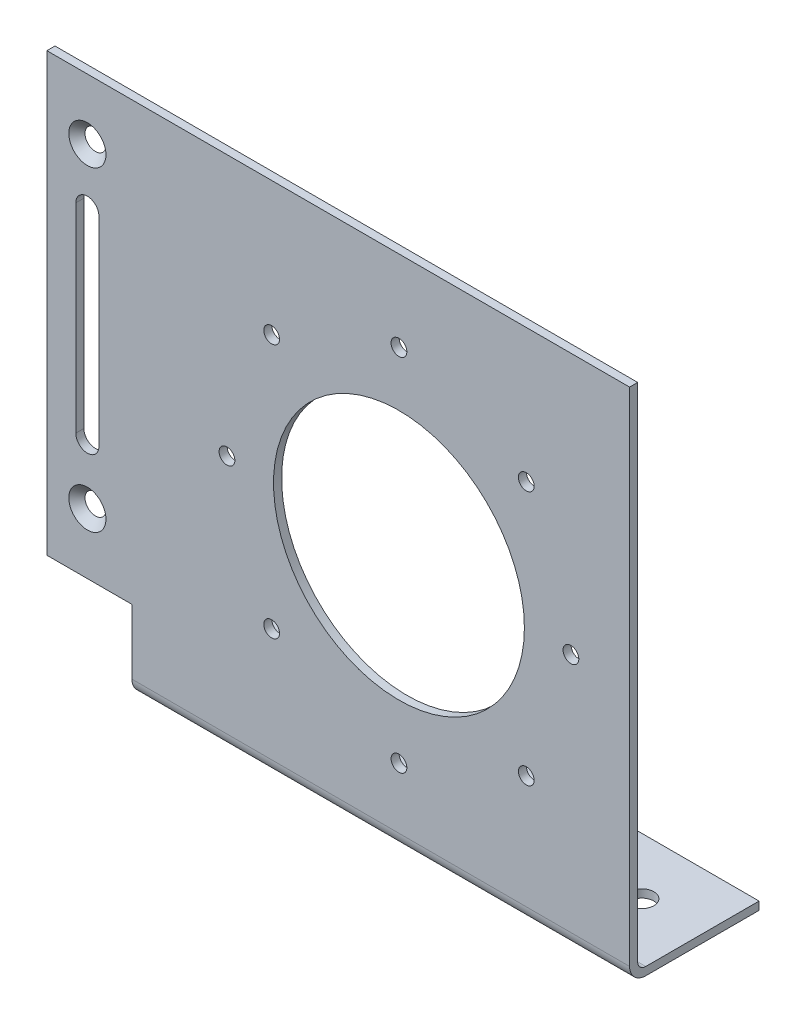
ISO-10303-21;
HEADER;
FILE_DESCRIPTION(('STEP AP214'),'2;1');
FILE_NAME('part.step','',(''),(''),'','','');
FILE_SCHEMA(('AUTOMOTIVE_DESIGN { 1 0 10303 214 1 1 1 1 }'));
ENDSEC;
DATA;
#1=APPLICATION_CONTEXT('core data for automotive mechanical design processes');
#2=APPLICATION_PROTOCOL_DEFINITION('international standard','automotive_design',2000,#1);
#3=PRODUCT_CONTEXT('',#1,'mechanical');
#4=PRODUCT('Part','Part','',(#3));
#5=PRODUCT_RELATED_PRODUCT_CATEGORY('part','',(#4));
#6=PRODUCT_DEFINITION_FORMATION('','',#4);
#7=PRODUCT_DEFINITION_CONTEXT('part definition',#1,'design');
#8=PRODUCT_DEFINITION('design','',#6,#7);
#9=PRODUCT_DEFINITION_SHAPE('','',#8);
#10=(LENGTH_UNIT() NAMED_UNIT(*) SI_UNIT(.MILLI.,.METRE.));
#11=(NAMED_UNIT(*) PLANE_ANGLE_UNIT() SI_UNIT($,.RADIAN.));
#12=(NAMED_UNIT(*) SI_UNIT($,.STERADIAN.) SOLID_ANGLE_UNIT());
#13=UNCERTAINTY_MEASURE_WITH_UNIT(LENGTH_MEASURE(1.E-05),#10,'distance_accuracy_value','');
#14=(GEOMETRIC_REPRESENTATION_CONTEXT(3) GLOBAL_UNCERTAINTY_ASSIGNED_CONTEXT((#13)) GLOBAL_UNIT_ASSIGNED_CONTEXT((#10,
#11,#12)) REPRESENTATION_CONTEXT('',''));
#15=CARTESIAN_POINT('',(0.,0.,0.));
#16=DIRECTION('',(0.,0.,1.));
#17=DIRECTION('',(1.,0.,0.));
#18=AXIS2_PLACEMENT_3D('',#15,#16,#17);
#19=CARTESIAN_POINT('',(0.,0.,0.));
#20=DIRECTION('',(0.,0.,1.));
#21=DIRECTION('',(1.,0.,0.));
#22=AXIS2_PLACEMENT_3D('',#19,#20,#21);
#23=PLANE('',#22);
#24=CARTESIAN_POINT('',(17.9765527034874,41.3541753746779,0.));
#25=DIRECTION('',(0.,0.,1.));
#26=DIRECTION('',(1.,0.,0.));
#27=AXIS2_PLACEMENT_3D('',#24,#25,#26);
#28=CIRCLE('',#27,1.95);
#29=CARTESIAN_POINT('',(19.9265527034874,41.3541753746779,0.));
#30=VERTEX_POINT('',#29);
#31=EDGE_CURVE('E205',#30,#30,#28,.T.);
#32=ORIENTED_EDGE('',*,*,#31,.T.);
#33=EDGE_LOOP('',(#32));
#34=FACE_BOUND('',#33,.T.);
#35=CARTESIAN_POINT('',(-13.489699059314,28.3204271374793,0.));
#36=DIRECTION('',(0.,0.,1.));
#37=DIRECTION('',(1.,0.,0.));
#38=AXIS2_PLACEMENT_3D('',#35,#36,#37);
#39=CIRCLE('',#38,1.95);
#40=CARTESIAN_POINT('',(-11.539699059314,28.3204271374793,0.));
#41=VERTEX_POINT('',#40);
#42=EDGE_CURVE('E202',#41,#41,#39,.T.);
#43=ORIENTED_EDGE('',*,*,#42,.T.);
#44=EDGE_LOOP('',(#43));
#45=FACE_BOUND('',#44,.T.);
#46=CARTESIAN_POINT('',(60.4765527034874,-3.14582462532208,0.));
#47=DIRECTION('',(0.,0.,1.));
#48=DIRECTION('',(1.,0.,0.));
#49=AXIS2_PLACEMENT_3D('',#46,#47,#48);
#50=CIRCLE('',#49,1.95);
#51=CARTESIAN_POINT('',(62.4265527034874,-3.14582462532208,0.));
#52=VERTEX_POINT('',#51);
#53=EDGE_CURVE('E199',#52,#52,#50,.T.);
#54=ORIENTED_EDGE('',*,*,#53,.T.);
#55=EDGE_LOOP('',(#54));
#56=FACE_BOUND('',#55,.T.);
#57=CARTESIAN_POINT('',(-13.489699059314,-34.6120763881235,0.));
#58=DIRECTION('',(0.,0.,1.));
#59=DIRECTION('',(1.,0.,0.));
#60=AXIS2_PLACEMENT_3D('',#57,#58,#59);
#61=CIRCLE('',#60,1.95);
#62=CARTESIAN_POINT('',(-11.539699059314,-34.6120763881235,0.));
#63=VERTEX_POINT('',#62);
#64=EDGE_CURVE('E196',#63,#63,#61,.T.);
#65=ORIENTED_EDGE('',*,*,#64,.T.);
#66=EDGE_LOOP('',(#65));
#67=FACE_BOUND('',#66,.T.);
#68=CARTESIAN_POINT('',(17.9765527034874,-47.6458246253221,0.));
#69=DIRECTION('',(0.,0.,1.));
#70=DIRECTION('',(1.,0.,0.));
#71=AXIS2_PLACEMENT_3D('',#68,#69,#70);
#72=CIRCLE('',#71,1.95);
#73=CARTESIAN_POINT('',(19.9265527034874,-47.6458246253221,0.));
#74=VERTEX_POINT('',#73);
#75=EDGE_CURVE('E193',#74,#74,#72,.T.);
#76=ORIENTED_EDGE('',*,*,#75,.T.);
#77=EDGE_LOOP('',(#76));
#78=FACE_BOUND('',#77,.T.);
#79=CARTESIAN_POINT('',(49.4428044662887,28.3204271374793,0.));
#80=DIRECTION('',(0.,0.,1.));
#81=DIRECTION('',(1.,0.,0.));
#82=AXIS2_PLACEMENT_3D('',#79,#80,#81);
#83=CIRCLE('',#82,1.95);
#84=CARTESIAN_POINT('',(51.3928044662887,28.3204271374793,0.));
#85=VERTEX_POINT('',#84);
#86=EDGE_CURVE('E190',#85,#85,#83,.T.);
#87=ORIENTED_EDGE('',*,*,#86,.T.);
#88=EDGE_LOOP('',(#87));
#89=FACE_BOUND('',#88,.T.);
#90=CARTESIAN_POINT('',(17.9765527034874,-3.14582462532208,0.));
#91=DIRECTION('',(0.,0.,1.));
#92=DIRECTION('',(1.,0.,0.));
#93=AXIS2_PLACEMENT_3D('',#90,#91,#92);
#94=CIRCLE('',#93,31.);
#95=CARTESIAN_POINT('',(48.9765527034874,-3.14582462532208,0.));
#96=VERTEX_POINT('',#95);
#97=EDGE_CURVE('E187',#96,#96,#94,.T.);
#98=ORIENTED_EDGE('',*,*,#97,.T.);
#99=EDGE_LOOP('',(#98));
#100=FACE_BOUND('',#99,.T.);
#101=CARTESIAN_POINT('',(-24.5234472965126,-3.14582462532208,0.));
#102=DIRECTION('',(0.,0.,1.));
#103=DIRECTION('',(1.,0.,0.));
#104=AXIS2_PLACEMENT_3D('',#101,#102,#103);
#105=CIRCLE('',#104,1.95);
#106=CARTESIAN_POINT('',(-22.5734472965126,-3.14582462532208,0.));
#107=VERTEX_POINT('',#106);
#108=EDGE_CURVE('E184',#107,#107,#105,.T.);
#109=ORIENTED_EDGE('',*,*,#108,.T.);
#110=EDGE_LOOP('',(#109));
#111=FACE_BOUND('',#110,.T.);
#112=CARTESIAN_POINT('',(49.4428044662887,-34.6120763881234,0.));
#113=DIRECTION('',(0.,0.,1.));
#114=DIRECTION('',(1.,0.,0.));
#115=AXIS2_PLACEMENT_3D('',#112,#113,#114);
#116=CIRCLE('',#115,1.95);
#117=CARTESIAN_POINT('',(51.3928044662887,-34.6120763881234,0.));
#118=VERTEX_POINT('',#117);
#119=EDGE_CURVE('E181',#118,#118,#116,.T.);
#120=ORIENTED_EDGE('',*,*,#119,.T.);
#121=EDGE_LOOP('',(#120));
#122=FACE_BOUND('',#121,.T.);
#123=DIRECTION('',(0.,-1.,0.));
#124=VECTOR('',#123,1.);
#125=CARTESIAN_POINT('',(-61.8816570408644,0.,0.));
#126=LINE('',#125,#124);
#127=CARTESIAN_POINT('',(-61.8816570408644,32.3541753746779,0.));
#128=VERTEX_POINT('',#127);
#129=CARTESIAN_POINT('',(-61.8816570408644,-16.9351822342256,0.));
#130=VERTEX_POINT('',#129);
#131=EDGE_CURVE('E178',#128,#130,#126,.T.);
#132=ORIENTED_EDGE('',*,*,#131,.T.);
#133=CARTESIAN_POINT('',(-59.0234472965126,-16.9351822342256,0.));
#134=DIRECTION('',(0.,0.,1.));
#135=DIRECTION('',(1.,0.,0.));
#136=AXIS2_PLACEMENT_3D('',#133,#134,#135);
#137=CIRCLE('',#136,2.85820974435177);
#138=CARTESIAN_POINT('',(-56.1652375521608,-16.9351822342256,0.));
#139=VERTEX_POINT('',#138);
#140=EDGE_CURVE('E144',#130,#139,#137,.T.);
#141=ORIENTED_EDGE('',*,*,#140,.T.);
#142=DIRECTION('',(0.,1.,0.));
#143=VECTOR('',#142,1.);
#144=CARTESIAN_POINT('',(-56.1652375521608,0.,0.));
#145=LINE('',#144,#143);
#146=CARTESIAN_POINT('',(-56.1652375521608,32.3541753746779,0.));
#147=VERTEX_POINT('',#146);
#148=EDGE_CURVE('E171',#139,#147,#145,.T.);
#149=ORIENTED_EDGE('',*,*,#148,.T.);
#150=CARTESIAN_POINT('',(-59.0234472965126,32.3541753746779,0.));
#151=DIRECTION('',(0.,0.,1.));
#152=DIRECTION('',(1.,0.,0.));
#153=AXIS2_PLACEMENT_3D('',#150,#151,#152);
#154=CIRCLE('',#153,2.85820974435178);
#155=EDGE_CURVE('E174',#147,#128,#154,.T.);
#156=ORIENTED_EDGE('',*,*,#155,.T.);
#157=EDGE_LOOP('',(#132,#141,#149,#156));
#158=FACE_BOUND('',#157,.T.);
#159=CARTESIAN_POINT('',(-59.0234472965126,46.3541753746779,0.));
#160=DIRECTION('',(0.,0.,1.));
#161=DIRECTION('',(1.,0.,0.));
#162=AXIS2_PLACEMENT_3D('',#159,#160,#161);
#163=CIRCLE('',#162,2.59);
#164=CARTESIAN_POINT('',(-56.4334472965126,46.3541753746779,0.));
#165=VERTEX_POINT('',#164);
#166=EDGE_CURVE('E211',#165,#165,#163,.T.);
#167=ORIENTED_EDGE('',*,*,#166,.T.);
#168=EDGE_LOOP('',(#167));
#169=FACE_BOUND('',#168,.T.);
#170=CARTESIAN_POINT('',(-59.0234472965126,-31.6458246253221,0.));
#171=DIRECTION('',(0.,0.,1.));
#172=DIRECTION('',(1.,0.,0.));
#173=AXIS2_PLACEMENT_3D('',#170,#171,#172);
#174=CIRCLE('',#173,2.59);
#175=CARTESIAN_POINT('',(-56.4334472965126,-31.6458246253221,0.));
#176=VERTEX_POINT('',#175);
#177=EDGE_CURVE('E43',#176,#176,#174,.T.);
#178=ORIENTED_EDGE('',*,*,#177,.T.);
#179=EDGE_LOOP('',(#178));
#180=FACE_BOUND('',#179,.T.);
#181=DIRECTION('',(0.,1.,0.));
#182=VECTOR('',#181,1.);
#183=CARTESIAN_POINT('',(74.9765527034874,-66.6458246253221,0.));
#184=LINE('',#183,#182);
#185=CARTESIAN_POINT('',(74.9765527034874,-62.6458246253221,0.));
#186=VERTEX_POINT('',#185);
#187=CARTESIAN_POINT('',(74.9765527034874,61.3541753746779,0.));
#188=VERTEX_POINT('',#187);
#189=EDGE_CURVE('E263',#186,#188,#184,.T.);
#190=ORIENTED_EDGE('',*,*,#189,.F.);
#191=DIRECTION('',(1.,0.,0.));
#192=VECTOR('',#191,1.);
#193=CARTESIAN_POINT('',(-48.0234472965126,-62.6458246253221,0.));
#194=LINE('',#193,#192);
#195=CARTESIAN_POINT('',(-48.0234472965126,-62.6458246253221,0.));
#196=VERTEX_POINT('',#195);
#197=EDGE_CURVE('E284',#186,#196,#194,.F.);
#198=ORIENTED_EDGE('',*,*,#197,.T.);
#199=DIRECTION('',(0.,-1.,0.));
#200=VECTOR('',#199,1.);
#201=CARTESIAN_POINT('',(-48.0234472965126,-46.6458246253221,0.));
#202=LINE('',#201,#200);
#203=CARTESIAN_POINT('',(-48.0234472965126,-46.6458246253221,0.));
#204=VERTEX_POINT('',#203);
#205=EDGE_CURVE('E260',#204,#196,#202,.T.);
#206=ORIENTED_EDGE('',*,*,#205,.F.);
#207=DIRECTION('',(1.,0.,0.));
#208=VECTOR('',#207,1.);
#209=CARTESIAN_POINT('',(-69.0234472965126,-46.6458246253221,0.));
#210=LINE('',#209,#208);
#211=CARTESIAN_POINT('',(-69.0234472965126,-46.6458246253221,0.));
#212=VERTEX_POINT('',#211);
#213=EDGE_CURVE('E258',#212,#204,#210,.T.);
#214=ORIENTED_EDGE('',*,*,#213,.F.);
#215=DIRECTION('',(0.,-1.,0.));
#216=VECTOR('',#215,1.);
#217=CARTESIAN_POINT('',(-69.0234472965126,-46.6458246253221,0.));
#218=LINE('',#217,#216);
#219=CARTESIAN_POINT('',(-69.0234472965126,61.3541753746779,0.));
#220=VERTEX_POINT('',#219);
#221=EDGE_CURVE('E241',#220,#212,#218,.T.);
#222=ORIENTED_EDGE('',*,*,#221,.F.);
#223=DIRECTION('',(-1.,0.,0.));
#224=VECTOR('',#223,1.);
#225=CARTESIAN_POINT('',(74.9765527034874,61.3541753746779,0.));
#226=LINE('',#225,#224);
#227=EDGE_CURVE('E246',#188,#220,#226,.T.);
#228=ORIENTED_EDGE('',*,*,#227,.F.);
#229=EDGE_LOOP('',(#190,#198,#206,#214,#222,#228));
#230=FACE_BOUND('',#229,.T.);
#231=ADVANCED_FACE('F39',(#34,#45,#56,#67,#78,#89,#100,#111,#122,#158,#169,#180,#230),#23,.F.);
#232=CARTESIAN_POINT('',(-69.0234472965126,-46.6458246253221,2.));
#233=DIRECTION('',(1.,0.,0.));
#234=DIRECTION('',(0.,0.,-1.));
#235=AXIS2_PLACEMENT_3D('',#232,#233,#234);
#236=PLANE('',#235);
#237=ORIENTED_EDGE('',*,*,#221,.T.);
#238=DIRECTION('',(0.,0.,-1.));
#239=VECTOR('',#238,1.);
#240=CARTESIAN_POINT('',(-69.0234472965126,-46.6458246253221,2.));
#241=LINE('',#240,#239);
#242=CARTESIAN_POINT('',(-69.0234472965126,-46.6458246253221,2.));
#243=VERTEX_POINT('',#242);
#244=EDGE_CURVE('E278',#243,#212,#241,.T.);
#245=ORIENTED_EDGE('',*,*,#244,.F.);
#246=DIRECTION('',(0.,-1.,0.));
#247=VECTOR('',#246,1.);
#248=CARTESIAN_POINT('',(-69.0234472965126,-46.6458246253221,2.));
#249=LINE('',#248,#247);
#250=CARTESIAN_POINT('',(-69.0234472965126,61.3541753746779,2.));
#251=VERTEX_POINT('',#250);
#252=EDGE_CURVE('E242',#251,#243,#249,.T.);
#253=ORIENTED_EDGE('',*,*,#252,.F.);
#254=DIRECTION('',(0.,0.,-1.));
#255=VECTOR('',#254,1.);
#256=CARTESIAN_POINT('',(-69.0234472965126,61.3541753746779,2.));
#257=LINE('',#256,#255);
#258=EDGE_CURVE('E255',#251,#220,#257,.T.);
#259=ORIENTED_EDGE('',*,*,#258,.T.);
#260=EDGE_LOOP('',(#237,#245,#253,#259));
#261=FACE_BOUND('',#260,.T.);
#262=ADVANCED_FACE('F319',(#261),#236,.F.);
#263=CARTESIAN_POINT('',(-69.0234472965126,-46.6458246253221,2.));
#264=DIRECTION('',(0.,1.,0.));
#265=DIRECTION('',(0.,0.,1.));
#266=AXIS2_PLACEMENT_3D('',#263,#264,#265);
#267=PLANE('',#266);
#268=ORIENTED_EDGE('',*,*,#213,.T.);
#269=DIRECTION('',(0.,0.,-1.));
#270=VECTOR('',#269,1.);
#271=CARTESIAN_POINT('',(-48.0234472965126,-46.6458246253221,2.));
#272=LINE('',#271,#270);
#273=CARTESIAN_POINT('',(-48.0234472965126,-46.6458246253221,2.));
#274=VERTEX_POINT('',#273);
#275=EDGE_CURVE('E275',#274,#204,#272,.T.);
#276=ORIENTED_EDGE('',*,*,#275,.F.);
#277=DIRECTION('',(1.,0.,0.));
#278=VECTOR('',#277,1.);
#279=CARTESIAN_POINT('',(-69.0234472965126,-46.6458246253221,2.));
#280=LINE('',#279,#278);
#281=EDGE_CURVE('E245',#243,#274,#280,.T.);
#282=ORIENTED_EDGE('',*,*,#281,.F.);
#283=ORIENTED_EDGE('',*,*,#244,.T.);
#284=EDGE_LOOP('',(#268,#276,#282,#283));
#285=FACE_BOUND('',#284,.T.);
#286=ADVANCED_FACE('F327',(#285),#267,.F.);
#287=CARTESIAN_POINT('',(-48.0234472965126,-46.6458246253221,2.));
#288=DIRECTION('',(1.,0.,0.));
#289=DIRECTION('',(0.,1.,0.));
#290=AXIS2_PLACEMENT_3D('',#287,#288,#289);
#291=PLANE('',#290);
#292=DIRECTION('',(0.,0.,-1.));
#293=VECTOR('',#292,1.);
#294=CARTESIAN_POINT('',(-48.0234472965126,-66.6458246253221,2.));
#295=LINE('',#294,#293);
#296=CARTESIAN_POINT('',(-48.0234472965126,-66.6458246253221,-2.));
#297=VERTEX_POINT('',#296);
#298=CARTESIAN_POINT('',(-48.0234472965126,-66.6458246253221,-30.));
#299=VERTEX_POINT('',#298);
#300=EDGE_CURVE('E273',#297,#299,#295,.T.);
#301=ORIENTED_EDGE('',*,*,#300,.F.);
#302=CARTESIAN_POINT('',(-48.0234472965126,-62.6458246253221,-2.));
#303=DIRECTION('',(1.,0.,0.));
#304=DIRECTION('',(0.,1.,0.));
#305=AXIS2_PLACEMENT_3D('',#302,#303,#304);
#306=CIRCLE('',#305,4.);
#307=CARTESIAN_POINT('',(-48.0234472965126,-62.6458246253221,2.));
#308=VERTEX_POINT('',#307);
#309=EDGE_CURVE('E11',#297,#308,#306,.F.);
#310=ORIENTED_EDGE('',*,*,#309,.T.);
#311=DIRECTION('',(0.,-1.,0.));
#312=VECTOR('',#311,1.);
#313=CARTESIAN_POINT('',(-48.0234472965126,-46.6458246253221,2.));
#314=LINE('',#313,#312);
#315=EDGE_CURVE('E248',#274,#308,#314,.T.);
#316=ORIENTED_EDGE('',*,*,#315,.F.);
#317=ORIENTED_EDGE('',*,*,#275,.T.);
#318=ORIENTED_EDGE('',*,*,#205,.T.);
#319=CARTESIAN_POINT('',(-48.0234472965126,-62.6458246253221,-2.));
#320=DIRECTION('',(1.,0.,0.));
#321=DIRECTION('',(0.,1.,0.));
#322=AXIS2_PLACEMENT_3D('',#319,#320,#321);
#323=CIRCLE('',#322,2.);
#324=CARTESIAN_POINT('',(-48.0234472965126,-64.6458246253221,-2.));
#325=VERTEX_POINT('',#324);
#326=EDGE_CURVE('E288',#196,#325,#323,.T.);
#327=ORIENTED_EDGE('',*,*,#326,.T.);
#328=DIRECTION('',(0.,0.,1.));
#329=VECTOR('',#328,1.);
#330=CARTESIAN_POINT('',(-48.0234472965126,-64.6458246253221,-30.));
#331=LINE('',#330,#329);
#332=CARTESIAN_POINT('',(-48.0234472965126,-64.6458246253221,-30.));
#333=VERTEX_POINT('',#332);
#334=EDGE_CURVE('E238',#333,#325,#331,.T.);
#335=ORIENTED_EDGE('',*,*,#334,.F.);
#336=DIRECTION('',(0.,1.,0.));
#337=VECTOR('',#336,1.);
#338=CARTESIAN_POINT('',(-48.0234472965126,-64.6458246253221,-30.));
#339=LINE('',#338,#337);
#340=EDGE_CURVE('E231',#299,#333,#339,.T.);
#341=ORIENTED_EDGE('',*,*,#340,.F.);
#342=EDGE_LOOP('',(#301,#310,#316,#317,#318,#327,#335,#341));
#343=FACE_BOUND('',#342,.T.);
#344=ADVANCED_FACE('F345',(#343),#291,.F.);
#345=CARTESIAN_POINT('',(74.9765527034874,-66.6458246253221,2.));
#346=DIRECTION('',(0.,1.,0.));
#347=DIRECTION('',(-1.,0.,0.));
#348=AXIS2_PLACEMENT_3D('',#345,#346,#347);
#349=PLANE('',#348);
#350=CARTESIAN_POINT('',(-33.0234472965126,-66.6458246253221,-16.));
#351=DIRECTION('',(0.,-1.,0.));
#352=DIRECTION('',(1.,0.,0.));
#353=AXIS2_PLACEMENT_3D('',#350,#351,#352);
#354=CIRCLE('',#353,3.);
#355=CARTESIAN_POINT('',(-30.0234472965126,-66.6458246253221,-16.));
#356=VERTEX_POINT('',#355);
#357=EDGE_CURVE('E217',#356,#356,#354,.T.);
#358=ORIENTED_EDGE('',*,*,#357,.F.);
#359=EDGE_LOOP('',(#358));
#360=FACE_BOUND('',#359,.T.);
#361=CARTESIAN_POINT('',(59.9765527034874,-66.6458246253221,-16.));
#362=DIRECTION('',(0.,-1.,0.));
#363=DIRECTION('',(1.,0.,0.));
#364=AXIS2_PLACEMENT_3D('',#361,#362,#363);
#365=CIRCLE('',#364,3.00000000000001);
#366=CARTESIAN_POINT('',(62.9765527034874,-66.6458246253221,-16.));
#367=VERTEX_POINT('',#366);
#368=EDGE_CURVE('E221',#367,#367,#365,.T.);
#369=ORIENTED_EDGE('',*,*,#368,.F.);
#370=EDGE_LOOP('',(#369));
#371=FACE_BOUND('',#370,.T.);
#372=DIRECTION('',(0.,0.,-1.));
#373=VECTOR('',#372,1.);
#374=CARTESIAN_POINT('',(74.9765527034874,-66.6458246253221,2.));
#375=LINE('',#374,#373);
#376=CARTESIAN_POINT('',(74.9765527034874,-66.6458246253221,-2.));
#377=VERTEX_POINT('',#376);
#378=CARTESIAN_POINT('',(74.9765527034874,-66.6458246253221,-30.));
#379=VERTEX_POINT('',#378);
#380=EDGE_CURVE('E271',#377,#379,#375,.T.);
#381=ORIENTED_EDGE('',*,*,#380,.F.);
#382=DIRECTION('',(1.,0.,0.));
#383=VECTOR('',#382,1.);
#384=CARTESIAN_POINT('',(-48.0234472965126,-66.6458246253221,-2.));
#385=LINE('',#384,#383);
#386=EDGE_CURVE('E48',#377,#297,#385,.F.);
#387=ORIENTED_EDGE('',*,*,#386,.T.);
#388=ORIENTED_EDGE('',*,*,#300,.T.);
#389=DIRECTION('',(-1.,0.,0.));
#390=VECTOR('',#389,1.);
#391=CARTESIAN_POINT('',(74.9765527034874,-66.6458246253221,-30.));
#392=LINE('',#391,#390);
#393=EDGE_CURVE('E227',#379,#299,#392,.T.);
#394=ORIENTED_EDGE('',*,*,#393,.F.);
#395=EDGE_LOOP('',(#381,#387,#388,#394));
#396=FACE_BOUND('',#395,.T.);
#397=ADVANCED_FACE('F341',(#360,#371,#396),#349,.F.);
#398=CARTESIAN_POINT('',(74.9765527034874,-66.6458246253221,2.));
#399=DIRECTION('',(-1.,0.,0.));
#400=DIRECTION('',(0.,0.,1.));
#401=AXIS2_PLACEMENT_3D('',#398,#399,#400);
#402=PLANE('',#401);
#403=DIRECTION('',(0.,1.,0.));
#404=VECTOR('',#403,1.);
#405=CARTESIAN_POINT('',(74.9765527034874,-66.6458246253221,2.));
#406=LINE('',#405,#404);
#407=CARTESIAN_POINT('',(74.9765527034874,-62.6458246253221,2.));
#408=VERTEX_POINT('',#407);
#409=CARTESIAN_POINT('',(74.9765527034874,61.3541753746779,2.));
#410=VERTEX_POINT('',#409);
#411=EDGE_CURVE('E251',#408,#410,#406,.T.);
#412=ORIENTED_EDGE('',*,*,#411,.F.);
#413=CARTESIAN_POINT('',(74.9765527034874,-62.6458246253221,-2.));
#414=DIRECTION('',(-1.,0.,0.));
#415=DIRECTION('',(0.,0.,1.));
#416=AXIS2_PLACEMENT_3D('',#413,#414,#415);
#417=CIRCLE('',#416,4.);
#418=EDGE_CURVE('E293',#408,#377,#417,.F.);
#419=ORIENTED_EDGE('',*,*,#418,.T.);
#420=ORIENTED_EDGE('',*,*,#380,.T.);
#421=DIRECTION('',(0.,-1.,0.));
#422=VECTOR('',#421,1.);
#423=CARTESIAN_POINT('',(74.9765527034874,-66.6458246253221,-30.));
#424=LINE('',#423,#422);
#425=CARTESIAN_POINT('',(74.9765527034874,-64.6458246253221,-30.));
#426=VERTEX_POINT('',#425);
#427=EDGE_CURVE('E224',#426,#379,#424,.T.);
#428=ORIENTED_EDGE('',*,*,#427,.F.);
#429=DIRECTION('',(0.,0.,1.));
#430=VECTOR('',#429,1.);
#431=CARTESIAN_POINT('',(74.9765527034874,-64.6458246253221,-30.));
#432=LINE('',#431,#430);
#433=CARTESIAN_POINT('',(74.9765527034874,-64.6458246253221,-2.));
#434=VERTEX_POINT('',#433);
#435=EDGE_CURVE('E235',#426,#434,#432,.T.);
#436=ORIENTED_EDGE('',*,*,#435,.T.);
#437=CARTESIAN_POINT('',(74.9765527034874,-62.6458246253221,-2.));
#438=DIRECTION('',(-1.,0.,0.));
#439=DIRECTION('',(0.,0.,1.));
#440=AXIS2_PLACEMENT_3D('',#437,#438,#439);
#441=CIRCLE('',#440,2.);
#442=EDGE_CURVE('E286',#434,#186,#441,.T.);
#443=ORIENTED_EDGE('',*,*,#442,.T.);
#444=ORIENTED_EDGE('',*,*,#189,.T.);
#445=DIRECTION('',(0.,0.,-1.));
#446=VECTOR('',#445,1.);
#447=CARTESIAN_POINT('',(74.9765527034874,61.3541753746779,2.));
#448=LINE('',#447,#446);
#449=EDGE_CURVE('E268',#410,#188,#448,.T.);
#450=ORIENTED_EDGE('',*,*,#449,.F.);
#451=EDGE_LOOP('',(#412,#419,#420,#428,#436,#443,#444,#450));
#452=FACE_BOUND('',#451,.T.);
#453=ADVANCED_FACE('F337',(#452),#402,.F.);
#454=CARTESIAN_POINT('',(74.9765527034874,61.3541753746779,2.));
#455=DIRECTION('',(0.,-1.,0.));
#456=DIRECTION('',(1.,0.,0.));
#457=AXIS2_PLACEMENT_3D('',#454,#455,#456);
#458=PLANE('',#457);
#459=ORIENTED_EDGE('',*,*,#227,.T.);
#460=ORIENTED_EDGE('',*,*,#258,.F.);
#461=DIRECTION('',(-1.,0.,0.));
#462=VECTOR('',#461,1.);
#463=CARTESIAN_POINT('',(74.9765527034874,61.3541753746779,2.));
#464=LINE('',#463,#462);
#465=EDGE_CURVE('E253',#410,#251,#464,.T.);
#466=ORIENTED_EDGE('',*,*,#465,.F.);
#467=ORIENTED_EDGE('',*,*,#449,.T.);
#468=EDGE_LOOP('',(#459,#460,#466,#467));
#469=FACE_BOUND('',#468,.T.);
#470=ADVANCED_FACE('F334',(#469),#458,.F.);
#471=CARTESIAN_POINT('',(0.,0.,2.));
#472=DIRECTION('',(0.,0.,1.));
#473=DIRECTION('',(1.,0.,0.));
#474=AXIS2_PLACEMENT_3D('',#471,#472,#473);
#475=PLANE('',#474);
#476=CARTESIAN_POINT('',(17.9765527034874,41.3541753746779,2.));
#477=DIRECTION('',(0.,0.,1.));
#478=DIRECTION('',(1.,0.,0.));
#479=AXIS2_PLACEMENT_3D('',#476,#477,#478);
#480=CIRCLE('',#479,1.95);
#481=CARTESIAN_POINT('',(19.9265527034874,41.3541753746779,2.));
#482=VERTEX_POINT('',#481);
#483=EDGE_CURVE('E175',#482,#482,#480,.T.);
#484=ORIENTED_EDGE('',*,*,#483,.F.);
#485=EDGE_LOOP('',(#484));
#486=FACE_BOUND('',#485,.T.);
#487=CARTESIAN_POINT('',(-13.489699059314,28.3204271374793,2.));
#488=DIRECTION('',(0.,0.,1.));
#489=DIRECTION('',(1.,0.,0.));
#490=AXIS2_PLACEMENT_3D('',#487,#488,#489);
#491=CIRCLE('',#490,1.95);
#492=CARTESIAN_POINT('',(-11.539699059314,28.3204271374793,2.));
#493=VERTEX_POINT('',#492);
#494=EDGE_CURVE('E163',#493,#493,#491,.T.);
#495=ORIENTED_EDGE('',*,*,#494,.F.);
#496=EDGE_LOOP('',(#495));
#497=FACE_BOUND('',#496,.T.);
#498=CARTESIAN_POINT('',(60.4765527034874,-3.14582462532208,2.));
#499=DIRECTION('',(0.,0.,1.));
#500=DIRECTION('',(1.,0.,0.));
#501=AXIS2_PLACEMENT_3D('',#498,#499,#500);
#502=CIRCLE('',#501,1.95);
#503=CARTESIAN_POINT('',(62.4265527034874,-3.14582462532208,2.));
#504=VERTEX_POINT('',#503);
#505=EDGE_CURVE('E166',#504,#504,#502,.T.);
#506=ORIENTED_EDGE('',*,*,#505,.F.);
#507=EDGE_LOOP('',(#506));
#508=FACE_BOUND('',#507,.T.);
#509=CARTESIAN_POINT('',(-13.489699059314,-34.6120763881235,2.));
#510=DIRECTION('',(0.,0.,1.));
#511=DIRECTION('',(1.,0.,0.));
#512=AXIS2_PLACEMENT_3D('',#509,#510,#511);
#513=CIRCLE('',#512,1.95);
#514=CARTESIAN_POINT('',(-11.539699059314,-34.6120763881235,2.));
#515=VERTEX_POINT('',#514);
#516=EDGE_CURVE('E409',#515,#515,#513,.T.);
#517=ORIENTED_EDGE('',*,*,#516,.F.);
#518=EDGE_LOOP('',(#517));
#519=FACE_BOUND('',#518,.T.);
#520=CARTESIAN_POINT('',(17.9765527034874,-47.6458246253221,2.));
#521=DIRECTION('',(0.,0.,1.));
#522=DIRECTION('',(1.,0.,0.));
#523=AXIS2_PLACEMENT_3D('',#520,#521,#522);
#524=CIRCLE('',#523,1.95);
#525=CARTESIAN_POINT('',(19.9265527034874,-47.6458246253221,2.));
#526=VERTEX_POINT('',#525);
#527=EDGE_CURVE('E413',#526,#526,#524,.T.);
#528=ORIENTED_EDGE('',*,*,#527,.F.);
#529=EDGE_LOOP('',(#528));
#530=FACE_BOUND('',#529,.T.);
#531=CARTESIAN_POINT('',(49.4428044662887,28.3204271374793,2.));
#532=DIRECTION('',(0.,0.,1.));
#533=DIRECTION('',(1.,0.,0.));
#534=AXIS2_PLACEMENT_3D('',#531,#532,#533);
#535=CIRCLE('',#534,1.95);
#536=CARTESIAN_POINT('',(51.3928044662887,28.3204271374793,2.));
#537=VERTEX_POINT('',#536);
#538=EDGE_CURVE('E417',#537,#537,#535,.T.);
#539=ORIENTED_EDGE('',*,*,#538,.F.);
#540=EDGE_LOOP('',(#539));
#541=FACE_BOUND('',#540,.T.);
#542=CARTESIAN_POINT('',(17.9765527034874,-3.14582462532208,2.));
#543=DIRECTION('',(0.,0.,1.));
#544=DIRECTION('',(1.,0.,0.));
#545=AXIS2_PLACEMENT_3D('',#542,#543,#544);
#546=CIRCLE('',#545,31.);
#547=CARTESIAN_POINT('',(48.9765527034874,-3.14582462532208,2.));
#548=VERTEX_POINT('',#547);
#549=EDGE_CURVE('E421',#548,#548,#546,.T.);
#550=ORIENTED_EDGE('',*,*,#549,.F.);
#551=EDGE_LOOP('',(#550));
#552=FACE_BOUND('',#551,.T.);
#553=CARTESIAN_POINT('',(-24.5234472965126,-3.14582462532208,2.));
#554=DIRECTION('',(0.,0.,1.));
#555=DIRECTION('',(1.,0.,0.));
#556=AXIS2_PLACEMENT_3D('',#553,#554,#555);
#557=CIRCLE('',#556,1.95);
#558=CARTESIAN_POINT('',(-22.5734472965126,-3.14582462532208,2.));
#559=VERTEX_POINT('',#558);
#560=EDGE_CURVE('E425',#559,#559,#557,.T.);
#561=ORIENTED_EDGE('',*,*,#560,.F.);
#562=EDGE_LOOP('',(#561));
#563=FACE_BOUND('',#562,.T.);
#564=CARTESIAN_POINT('',(49.4428044662887,-34.6120763881234,2.));
#565=DIRECTION('',(0.,0.,1.));
#566=DIRECTION('',(1.,0.,0.));
#567=AXIS2_PLACEMENT_3D('',#564,#565,#566);
#568=CIRCLE('',#567,1.95);
#569=CARTESIAN_POINT('',(51.3928044662887,-34.6120763881234,2.));
#570=VERTEX_POINT('',#569);
#571=EDGE_CURVE('E428',#570,#570,#568,.T.);
#572=ORIENTED_EDGE('',*,*,#571,.F.);
#573=EDGE_LOOP('',(#572));
#574=FACE_BOUND('',#573,.T.);
#575=CARTESIAN_POINT('',(-59.0234472965126,-16.9351822342256,2.));
#576=DIRECTION('',(0.,0.,1.));
#577=DIRECTION('',(1.,0.,0.));
#578=AXIS2_PLACEMENT_3D('',#575,#576,#577);
#579=CIRCLE('',#578,2.85820974435177);
#580=CARTESIAN_POINT('',(-61.8816570408644,-16.9351822342256,2.));
#581=VERTEX_POINT('',#580);
#582=CARTESIAN_POINT('',(-56.1652375521608,-16.9351822342256,2.));
#583=VERTEX_POINT('',#582);
#584=EDGE_CURVE('E64',#581,#583,#579,.T.);
#585=ORIENTED_EDGE('',*,*,#584,.F.);
#586=DIRECTION('',(0.,-1.,0.));
#587=VECTOR('',#586,1.);
#588=CARTESIAN_POINT('',(-61.8816570408644,-16.9351822342256,2.));
#589=LINE('',#588,#587);
#590=CARTESIAN_POINT('',(-61.8816570408644,32.3541753746779,2.));
#591=VERTEX_POINT('',#590);
#592=EDGE_CURVE('E150',#591,#581,#589,.T.);
#593=ORIENTED_EDGE('',*,*,#592,.F.);
#594=CARTESIAN_POINT('',(-59.0234472965126,32.3541753746779,2.));
#595=DIRECTION('',(0.,0.,1.));
#596=DIRECTION('',(1.,0.,0.));
#597=AXIS2_PLACEMENT_3D('',#594,#595,#596);
#598=CIRCLE('',#597,2.85820974435178);
#599=CARTESIAN_POINT('',(-56.1652375521608,32.3541753746779,2.));
#600=VERTEX_POINT('',#599);
#601=EDGE_CURVE('E156',#600,#591,#598,.T.);
#602=ORIENTED_EDGE('',*,*,#601,.F.);
#603=DIRECTION('',(0.,1.,0.));
#604=VECTOR('',#603,1.);
#605=CARTESIAN_POINT('',(-56.1652375521608,-16.9351822342256,2.));
#606=LINE('',#605,#604);
#607=EDGE_CURVE('E162',#583,#600,#606,.T.);
#608=ORIENTED_EDGE('',*,*,#607,.F.);
#609=EDGE_LOOP('',(#585,#593,#602,#608));
#610=FACE_BOUND('',#609,.T.);
#611=CARTESIAN_POINT('',(-59.0234472965126,46.3541753746779,2.));
#612=DIRECTION('',(0.,0.,1.));
#613=DIRECTION('',(1.,0.,0.));
#614=AXIS2_PLACEMENT_3D('',#611,#612,#613);
#615=CIRCLE('',#614,4.59);
#616=CARTESIAN_POINT('',(-54.4334472965126,46.3541753746779,2.));
#617=VERTEX_POINT('',#616);
#618=EDGE_CURVE('E208',#617,#617,#615,.T.);
#619=ORIENTED_EDGE('',*,*,#618,.F.);
#620=EDGE_LOOP('',(#619));
#621=FACE_BOUND('',#620,.T.);
#622=CARTESIAN_POINT('',(-59.0234472965126,-31.6458246253221,2.));
#623=DIRECTION('',(0.,0.,1.));
#624=DIRECTION('',(1.,0.,0.));
#625=AXIS2_PLACEMENT_3D('',#622,#623,#624);
#626=CIRCLE('',#625,4.59);
#627=CARTESIAN_POINT('',(-54.4334472965126,-31.6458246253221,2.));
#628=VERTEX_POINT('',#627);
#629=EDGE_CURVE('E214',#628,#628,#626,.T.);
#630=ORIENTED_EDGE('',*,*,#629,.F.);
#631=EDGE_LOOP('',(#630));
#632=FACE_BOUND('',#631,.T.);
#633=ORIENTED_EDGE('',*,*,#315,.T.);
#634=DIRECTION('',(1.,0.,0.));
#635=VECTOR('',#634,1.);
#636=CARTESIAN_POINT('',(74.9765527034874,-62.6458246253221,2.));
#637=LINE('',#636,#635);
#638=EDGE_CURVE('E290',#308,#408,#637,.T.);
#639=ORIENTED_EDGE('',*,*,#638,.T.);
#640=ORIENTED_EDGE('',*,*,#411,.T.);
#641=ORIENTED_EDGE('',*,*,#465,.T.);
#642=ORIENTED_EDGE('',*,*,#252,.T.);
#643=ORIENTED_EDGE('',*,*,#281,.T.);
#644=EDGE_LOOP('',(#633,#639,#640,#641,#642,#643));
#645=FACE_BOUND('',#644,.T.);
#646=ADVANCED_FACE('F160',(#486,#497,#508,#519,#530,#541,#552,#563,#574,#610,#621,#632,#645),
#475,.T.);
#647=CARTESIAN_POINT('',(74.9765527034874,-64.6458246253221,-30.));
#648=DIRECTION('',(0.,-1.,0.));
#649=DIRECTION('',(0.,0.,-1.));
#650=AXIS2_PLACEMENT_3D('',#647,#648,#649);
#651=PLANE('',#650);
#652=CARTESIAN_POINT('',(-33.0234472965126,-64.6458246253221,-16.));
#653=DIRECTION('',(0.,-1.,0.));
#654=DIRECTION('',(0.,0.,-1.));
#655=AXIS2_PLACEMENT_3D('',#652,#653,#654);
#656=CIRCLE('',#655,3.);
#657=CARTESIAN_POINT('',(-33.0234472965126,-64.6458246253221,-19.));
#658=VERTEX_POINT('',#657);
#659=EDGE_CURVE('E228',#658,#658,#656,.T.);
#660=ORIENTED_EDGE('',*,*,#659,.T.);
#661=EDGE_LOOP('',(#660));
#662=FACE_BOUND('',#661,.T.);
#663=CARTESIAN_POINT('',(59.9765527034874,-64.6458246253221,-16.));
#664=DIRECTION('',(0.,-1.,0.));
#665=DIRECTION('',(0.,0.,-1.));
#666=AXIS2_PLACEMENT_3D('',#663,#664,#665);
#667=CIRCLE('',#666,3.00000000000001);
#668=CARTESIAN_POINT('',(59.9765527034874,-64.6458246253221,-19.));
#669=VERTEX_POINT('',#668);
#670=EDGE_CURVE('E220',#669,#669,#667,.T.);
#671=ORIENTED_EDGE('',*,*,#670,.T.);
#672=EDGE_LOOP('',(#671));
#673=FACE_BOUND('',#672,.T.);
#674=ORIENTED_EDGE('',*,*,#334,.T.);
#675=DIRECTION('',(1.,0.,0.));
#676=VECTOR('',#675,1.);
#677=CARTESIAN_POINT('',(74.9765527034874,-64.6458246253221,-2.));
#678=LINE('',#677,#676);
#679=EDGE_CURVE('E281',#325,#434,#678,.T.);
#680=ORIENTED_EDGE('',*,*,#679,.T.);
#681=ORIENTED_EDGE('',*,*,#435,.F.);
#682=DIRECTION('',(1.,0.,0.));
#683=VECTOR('',#682,1.);
#684=CARTESIAN_POINT('',(74.9765527034874,-64.6458246253221,-30.));
#685=LINE('',#684,#683);
#686=EDGE_CURVE('E233',#333,#426,#685,.T.);
#687=ORIENTED_EDGE('',*,*,#686,.F.);
#688=EDGE_LOOP('',(#674,#680,#681,#687));
#689=FACE_BOUND('',#688,.T.);
#690=ADVANCED_FACE('F300',(#662,#673,#689),#651,.F.);
#691=CARTESIAN_POINT('',(0.,0.,-30.));
#692=DIRECTION('',(0.,0.,1.));
#693=DIRECTION('',(1.,0.,0.));
#694=AXIS2_PLACEMENT_3D('',#691,#692,#693);
#695=PLANE('',#694);
#696=ORIENTED_EDGE('',*,*,#427,.T.);
#697=ORIENTED_EDGE('',*,*,#393,.T.);
#698=ORIENTED_EDGE('',*,*,#340,.T.);
#699=ORIENTED_EDGE('',*,*,#686,.T.);
#700=EDGE_LOOP('',(#696,#697,#698,#699));
#701=FACE_BOUND('',#700,.T.);
#702=ADVANCED_FACE('F354',(#701),#695,.F.);
#703=CARTESIAN_POINT('',(74.9765527034874,-62.6458246253221,-2.));
#704=DIRECTION('',(-1.,0.,0.));
#705=DIRECTION('',(0.,0.,1.));
#706=AXIS2_PLACEMENT_3D('',#703,#704,#705);
#707=CYLINDRICAL_SURFACE('',#706,2.);
#708=ORIENTED_EDGE('',*,*,#326,.F.);
#709=ORIENTED_EDGE('',*,*,#197,.F.);
#710=ORIENTED_EDGE('',*,*,#442,.F.);
#711=ORIENTED_EDGE('',*,*,#679,.F.);
#712=EDGE_LOOP('',(#708,#709,#710,#711));
#713=FACE_BOUND('',#712,.T.);
#714=ADVANCED_FACE('F352',(#713),#707,.F.);
#715=CARTESIAN_POINT('',(0.,-62.6458246253221,-2.));
#716=DIRECTION('',(-1.,0.,0.));
#717=DIRECTION('',(0.,-1.,0.));
#718=AXIS2_PLACEMENT_3D('',#715,#716,#717);
#719=CYLINDRICAL_SURFACE('',#718,4.);
#720=ORIENTED_EDGE('',*,*,#309,.F.);
#721=ORIENTED_EDGE('',*,*,#386,.F.);
#722=ORIENTED_EDGE('',*,*,#418,.F.);
#723=ORIENTED_EDGE('',*,*,#638,.F.);
#724=EDGE_LOOP('',(#720,#721,#722,#723));
#725=FACE_BOUND('',#724,.T.);
#726=ADVANCED_FACE('F41',(#725),#719,.T.);
#727=CARTESIAN_POINT('',(59.9765527034874,61.3541753746779,-16.));
#728=DIRECTION('',(0.,-1.,0.));
#729=DIRECTION('',(1.,0.,0.));
#730=AXIS2_PLACEMENT_3D('',#727,#728,#729);
#731=CYLINDRICAL_SURFACE('',#730,3.00000000000001);
#732=ORIENTED_EDGE('',*,*,#368,.T.);
#733=EDGE_LOOP('',(#732));
#734=FACE_BOUND('',#733,.T.);
#735=ORIENTED_EDGE('',*,*,#670,.F.);
#736=EDGE_LOOP('',(#735));
#737=FACE_BOUND('',#736,.T.);
#738=ADVANCED_FACE('F306',(#734,#737),#731,.F.);
#739=CARTESIAN_POINT('',(-33.0234472965126,61.3541753746779,-16.));
#740=DIRECTION('',(0.,-1.,0.));
#741=DIRECTION('',(1.,0.,0.));
#742=AXIS2_PLACEMENT_3D('',#739,#740,#741);
#743=CYLINDRICAL_SURFACE('',#742,3.);
#744=ORIENTED_EDGE('',*,*,#357,.T.);
#745=EDGE_LOOP('',(#744));
#746=FACE_BOUND('',#745,.T.);
#747=ORIENTED_EDGE('',*,*,#659,.F.);
#748=EDGE_LOOP('',(#747));
#749=FACE_BOUND('',#748,.T.);
#750=ADVANCED_FACE('F303',(#746,#749),#743,.F.);
#751=CARTESIAN_POINT('',(-59.0234472965126,-31.6458246253221,2.));
#752=DIRECTION('',(0.,0.,1.));
#753=DIRECTION('',(1.,0.,0.));
#754=AXIS2_PLACEMENT_3D('',#751,#752,#753);
#755=CONICAL_SURFACE('',#754,4.59,0.785398163397449);
#756=ORIENTED_EDGE('',*,*,#629,.T.);
#757=EDGE_LOOP('',(#756));
#758=FACE_BOUND('',#757,.T.);
#759=ORIENTED_EDGE('',*,*,#177,.F.);
#760=EDGE_LOOP('',(#759));
#761=FACE_BOUND('',#760,.T.);
#762=ADVANCED_FACE('F305',(#758,#761),#755,.F.);
#763=CARTESIAN_POINT('',(-59.0234472965126,46.3541753746779,2.));
#764=DIRECTION('',(0.,0.,1.));
#765=DIRECTION('',(1.,0.,0.));
#766=AXIS2_PLACEMENT_3D('',#763,#764,#765);
#767=CONICAL_SURFACE('',#766,4.59,0.785398163397447);
#768=ORIENTED_EDGE('',*,*,#618,.T.);
#769=EDGE_LOOP('',(#768));
#770=FACE_BOUND('',#769,.T.);
#771=ORIENTED_EDGE('',*,*,#166,.F.);
#772=EDGE_LOOP('',(#771));
#773=FACE_BOUND('',#772,.T.);
#774=ADVANCED_FACE('F313',(#770,#773),#767,.F.);
#775=CARTESIAN_POINT('',(-59.0234472965126,-16.9351822342256,-30.));
#776=DIRECTION('',(0.,0.,1.));
#777=DIRECTION('',(1.,0.,0.));
#778=AXIS2_PLACEMENT_3D('',#775,#776,#777);
#779=CYLINDRICAL_SURFACE('',#778,2.85820974435177);
#780=DIRECTION('',(0.,0.,1.));
#781=VECTOR('',#780,1.);
#782=CARTESIAN_POINT('',(-61.8816570408644,-16.9351822342256,-30.));
#783=LINE('',#782,#781);
#784=EDGE_CURVE('E140',#130,#581,#783,.T.);
#785=ORIENTED_EDGE('',*,*,#784,.T.);
#786=ORIENTED_EDGE('',*,*,#584,.T.);
#787=DIRECTION('',(0.,0.,1.));
#788=VECTOR('',#787,1.);
#789=CARTESIAN_POINT('',(-56.1652375521608,-16.9351822342256,-30.));
#790=LINE('',#789,#788);
#791=EDGE_CURVE('E157',#139,#583,#790,.T.);
#792=ORIENTED_EDGE('',*,*,#791,.F.);
#793=ORIENTED_EDGE('',*,*,#140,.F.);
#794=EDGE_LOOP('',(#785,#786,#792,#793));
#795=FACE_BOUND('',#794,.T.);
#796=ADVANCED_FACE('F142',(#795),#779,.F.);
#797=CARTESIAN_POINT('',(-61.8816570408644,-16.9351822342256,-30.));
#798=DIRECTION('',(-1.,0.,0.));
#799=DIRECTION('',(0.,-1.,0.));
#800=AXIS2_PLACEMENT_3D('',#797,#798,#799);
#801=PLANE('',#800);
#802=DIRECTION('',(0.,0.,1.));
#803=VECTOR('',#802,1.);
#804=CARTESIAN_POINT('',(-61.8816570408644,32.3541753746779,-30.));
#805=LINE('',#804,#803);
#806=EDGE_CURVE('E147',#128,#591,#805,.T.);
#807=ORIENTED_EDGE('',*,*,#806,.T.);
#808=ORIENTED_EDGE('',*,*,#592,.T.);
#809=ORIENTED_EDGE('',*,*,#784,.F.);
#810=ORIENTED_EDGE('',*,*,#131,.F.);
#811=EDGE_LOOP('',(#807,#808,#809,#810));
#812=FACE_BOUND('',#811,.T.);
#813=ADVANCED_FACE('F151',(#812),#801,.F.);
#814=CARTESIAN_POINT('',(-59.0234472965126,32.3541753746779,-30.));
#815=DIRECTION('',(0.,0.,1.));
#816=DIRECTION('',(1.,0.,0.));
#817=AXIS2_PLACEMENT_3D('',#814,#815,#816);
#818=CYLINDRICAL_SURFACE('',#817,2.85820974435178);
#819=DIRECTION('',(0.,0.,1.));
#820=VECTOR('',#819,1.);
#821=CARTESIAN_POINT('',(-56.1652375521608,32.3541753746779,-30.));
#822=LINE('',#821,#820);
#823=EDGE_CURVE('E56',#147,#600,#822,.T.);
#824=ORIENTED_EDGE('',*,*,#823,.T.);
#825=ORIENTED_EDGE('',*,*,#601,.T.);
#826=ORIENTED_EDGE('',*,*,#806,.F.);
#827=ORIENTED_EDGE('',*,*,#155,.F.);
#828=EDGE_LOOP('',(#824,#825,#826,#827));
#829=FACE_BOUND('',#828,.T.);
#830=ADVANCED_FACE('F439',(#829),#818,.F.);
#831=CARTESIAN_POINT('',(-56.1652375521608,-16.9351822342256,-30.));
#832=DIRECTION('',(1.,0.,0.));
#833=DIRECTION('',(0.,0.,-1.));
#834=AXIS2_PLACEMENT_3D('',#831,#832,#833);
#835=PLANE('',#834);
#836=ORIENTED_EDGE('',*,*,#791,.T.);
#837=ORIENTED_EDGE('',*,*,#607,.T.);
#838=ORIENTED_EDGE('',*,*,#823,.F.);
#839=ORIENTED_EDGE('',*,*,#148,.F.);
#840=EDGE_LOOP('',(#836,#837,#838,#839));
#841=FACE_BOUND('',#840,.T.);
#842=ADVANCED_FACE('F440',(#841),#835,.F.);
#843=CARTESIAN_POINT('',(49.4428044662887,-34.6120763881234,-30.));
#844=DIRECTION('',(0.,0.,1.));
#845=DIRECTION('',(1.,0.,0.));
#846=AXIS2_PLACEMENT_3D('',#843,#844,#845);
#847=CYLINDRICAL_SURFACE('',#846,1.95);
#848=ORIENTED_EDGE('',*,*,#571,.T.);
#849=EDGE_LOOP('',(#848));
#850=FACE_BOUND('',#849,.T.);
#851=ORIENTED_EDGE('',*,*,#119,.F.);
#852=EDGE_LOOP('',(#851));
#853=FACE_BOUND('',#852,.T.);
#854=ADVANCED_FACE('F460',(#850,#853),#847,.F.);
#855=CARTESIAN_POINT('',(-24.5234472965126,-3.14582462532208,-30.));
#856=DIRECTION('',(0.,0.,1.));
#857=DIRECTION('',(1.,0.,0.));
#858=AXIS2_PLACEMENT_3D('',#855,#856,#857);
#859=CYLINDRICAL_SURFACE('',#858,1.95);
#860=ORIENTED_EDGE('',*,*,#560,.T.);
#861=EDGE_LOOP('',(#860));
#862=FACE_BOUND('',#861,.T.);
#863=ORIENTED_EDGE('',*,*,#108,.F.);
#864=EDGE_LOOP('',(#863));
#865=FACE_BOUND('',#864,.T.);
#866=ADVANCED_FACE('F466',(#862,#865),#859,.F.);
#867=CARTESIAN_POINT('',(17.9765527034874,-3.14582462532208,-30.));
#868=DIRECTION('',(0.,0.,1.));
#869=DIRECTION('',(1.,0.,0.));
#870=AXIS2_PLACEMENT_3D('',#867,#868,#869);
#871=CYLINDRICAL_SURFACE('',#870,31.);
#872=ORIENTED_EDGE('',*,*,#549,.T.);
#873=EDGE_LOOP('',(#872));
#874=FACE_BOUND('',#873,.T.);
#875=ORIENTED_EDGE('',*,*,#97,.F.);
#876=EDGE_LOOP('',(#875));
#877=FACE_BOUND('',#876,.T.);
#878=ADVANCED_FACE('F462',(#874,#877),#871,.F.);
#879=CARTESIAN_POINT('',(49.4428044662887,28.3204271374793,-30.));
#880=DIRECTION('',(0.,0.,1.));
#881=DIRECTION('',(1.,0.,0.));
#882=AXIS2_PLACEMENT_3D('',#879,#880,#881);
#883=CYLINDRICAL_SURFACE('',#882,1.95);
#884=ORIENTED_EDGE('',*,*,#538,.T.);
#885=EDGE_LOOP('',(#884));
#886=FACE_BOUND('',#885,.T.);
#887=ORIENTED_EDGE('',*,*,#86,.F.);
#888=EDGE_LOOP('',(#887));
#889=FACE_BOUND('',#888,.T.);
#890=ADVANCED_FACE('F465',(#886,#889),#883,.F.);
#891=CARTESIAN_POINT('',(17.9765527034874,-47.6458246253221,-30.));
#892=DIRECTION('',(0.,0.,1.));
#893=DIRECTION('',(1.,0.,0.));
#894=AXIS2_PLACEMENT_3D('',#891,#892,#893);
#895=CYLINDRICAL_SURFACE('',#894,1.95);
#896=ORIENTED_EDGE('',*,*,#527,.T.);
#897=EDGE_LOOP('',(#896));
#898=FACE_BOUND('',#897,.T.);
#899=ORIENTED_EDGE('',*,*,#75,.F.);
#900=EDGE_LOOP('',(#899));
#901=FACE_BOUND('',#900,.T.);
#902=ADVANCED_FACE('F470',(#898,#901),#895,.F.);
#903=CARTESIAN_POINT('',(-13.489699059314,-34.6120763881235,-30.));
#904=DIRECTION('',(0.,0.,1.));
#905=DIRECTION('',(1.,0.,0.));
#906=AXIS2_PLACEMENT_3D('',#903,#904,#905);
#907=CYLINDRICAL_SURFACE('',#906,1.95);
#908=ORIENTED_EDGE('',*,*,#516,.T.);
#909=EDGE_LOOP('',(#908));
#910=FACE_BOUND('',#909,.T.);
#911=ORIENTED_EDGE('',*,*,#64,.F.);
#912=EDGE_LOOP('',(#911));
#913=FACE_BOUND('',#912,.T.);
#914=ADVANCED_FACE('F485',(#910,#913),#907,.F.);
#915=CARTESIAN_POINT('',(60.4765527034874,-3.14582462532208,-30.));
#916=DIRECTION('',(0.,0.,1.));
#917=DIRECTION('',(1.,0.,0.));
#918=AXIS2_PLACEMENT_3D('',#915,#916,#917);
#919=CYLINDRICAL_SURFACE('',#918,1.95);
#920=ORIENTED_EDGE('',*,*,#505,.T.);
#921=EDGE_LOOP('',(#920));
#922=FACE_BOUND('',#921,.T.);
#923=ORIENTED_EDGE('',*,*,#53,.F.);
#924=EDGE_LOOP('',(#923));
#925=FACE_BOUND('',#924,.T.);
#926=ADVANCED_FACE('F481',(#922,#925),#919,.F.);
#927=CARTESIAN_POINT('',(-13.489699059314,28.3204271374793,-30.));
#928=DIRECTION('',(0.,0.,1.));
#929=DIRECTION('',(1.,0.,0.));
#930=AXIS2_PLACEMENT_3D('',#927,#928,#929);
#931=CYLINDRICAL_SURFACE('',#930,1.95);
#932=ORIENTED_EDGE('',*,*,#494,.T.);
#933=EDGE_LOOP('',(#932));
#934=FACE_BOUND('',#933,.T.);
#935=ORIENTED_EDGE('',*,*,#42,.F.);
#936=EDGE_LOOP('',(#935));
#937=FACE_BOUND('',#936,.T.);
#938=ADVANCED_FACE('F477',(#934,#937),#931,.F.);
#939=CARTESIAN_POINT('',(17.9765527034874,41.3541753746779,-30.));
#940=DIRECTION('',(0.,0.,1.));
#941=DIRECTION('',(1.,0.,0.));
#942=AXIS2_PLACEMENT_3D('',#939,#940,#941);
#943=CYLINDRICAL_SURFACE('',#942,1.95);
#944=ORIENTED_EDGE('',*,*,#483,.T.);
#945=EDGE_LOOP('',(#944));
#946=FACE_BOUND('',#945,.T.);
#947=ORIENTED_EDGE('',*,*,#31,.F.);
#948=EDGE_LOOP('',(#947));
#949=FACE_BOUND('',#948,.T.);
#950=ADVANCED_FACE('F480',(#946,#949),#943,.F.);
#951=CLOSED_SHELL('',(#231,#262,#286,#344,#397,#453,#470,#646,#690,#702,#714,#726,#738,#750,
#762,#774,#796,#813,#830,#842,#854,#866,#878,#890,#902,#914,#926,#938,#950));
#952=MANIFOLD_SOLID_BREP('B2',#951);
#953=ADVANCED_BREP_SHAPE_REPRESENTATION('',(#18,#952),#14);
#954=SHAPE_DEFINITION_REPRESENTATION(#9,#953);
ENDSEC;
END-ISO-10303-21;
